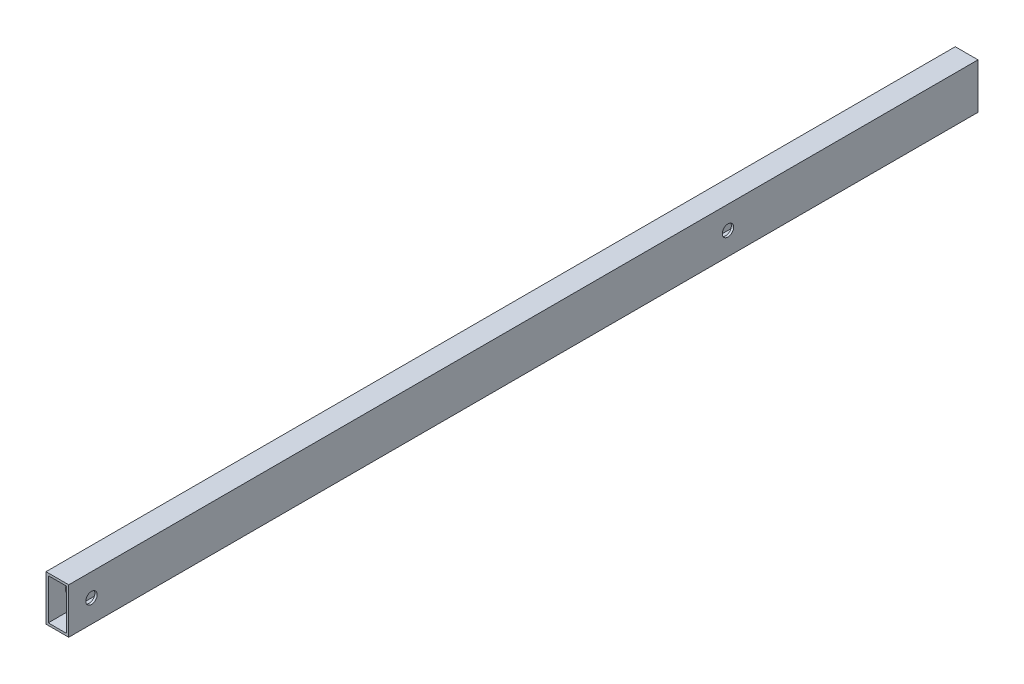
ISO-10303-21;
HEADER;
FILE_DESCRIPTION(('STEP AP214'),'2;1');
FILE_NAME('part.step','',(''),(''),'','','');
FILE_SCHEMA(('AUTOMOTIVE_DESIGN { 1 0 10303 214 1 1 1 1 }'));
ENDSEC;
DATA;
#1=APPLICATION_CONTEXT('core data for automotive mechanical design processes');
#2=APPLICATION_PROTOCOL_DEFINITION('international standard','automotive_design',2000,#1);
#3=PRODUCT_CONTEXT('',#1,'mechanical');
#4=PRODUCT('Part','Part','',(#3));
#5=PRODUCT_RELATED_PRODUCT_CATEGORY('part','',(#4));
#6=PRODUCT_DEFINITION_FORMATION('','',#4);
#7=PRODUCT_DEFINITION_CONTEXT('part definition',#1,'design');
#8=PRODUCT_DEFINITION('design','',#6,#7);
#9=PRODUCT_DEFINITION_SHAPE('','',#8);
#10=(LENGTH_UNIT() NAMED_UNIT(*) SI_UNIT(.MILLI.,.METRE.));
#11=(NAMED_UNIT(*) PLANE_ANGLE_UNIT() SI_UNIT($,.RADIAN.));
#12=(NAMED_UNIT(*) SI_UNIT($,.STERADIAN.) SOLID_ANGLE_UNIT());
#13=UNCERTAINTY_MEASURE_WITH_UNIT(LENGTH_MEASURE(1.E-05),#10,'distance_accuracy_value','');
#14=(GEOMETRIC_REPRESENTATION_CONTEXT(3) GLOBAL_UNCERTAINTY_ASSIGNED_CONTEXT((#13)) GLOBAL_UNIT_ASSIGNED_CONTEXT((#10,
#11,#12)) REPRESENTATION_CONTEXT('',''));
#15=CARTESIAN_POINT('',(0.,0.,0.));
#16=DIRECTION('',(0.,0.,1.));
#17=DIRECTION('',(1.,0.,0.));
#18=AXIS2_PLACEMENT_3D('',#15,#16,#17);
#19=CARTESIAN_POINT('',(0.,0.,400.));
#20=DIRECTION('',(0.,0.,-1.));
#21=DIRECTION('',(-1.,0.,0.));
#22=AXIS2_PLACEMENT_3D('',#19,#20,#21);
#23=PLANE('',#22);
#24=DIRECTION('',(0.,1.,0.));
#25=VECTOR('',#24,1.);
#26=CARTESIAN_POINT('',(5.00000000000001,-9.99999999999999,400.));
#27=LINE('',#26,#25);
#28=CARTESIAN_POINT('',(5.00000000000001,-9.99999999999999,400.));
#29=VERTEX_POINT('',#28);
#30=CARTESIAN_POINT('',(5.00000000000001,10.,400.));
#31=VERTEX_POINT('',#30);
#32=EDGE_CURVE('E142',#29,#31,#27,.T.);
#33=ORIENTED_EDGE('',*,*,#32,.T.);
#34=DIRECTION('',(-1.,0.,0.));
#35=VECTOR('',#34,1.);
#36=CARTESIAN_POINT('',(-4.99999999999999,10.,400.));
#37=LINE('',#36,#35);
#38=CARTESIAN_POINT('',(-4.99999999999999,10.,400.));
#39=VERTEX_POINT('',#38);
#40=EDGE_CURVE('E145',#31,#39,#37,.T.);
#41=ORIENTED_EDGE('',*,*,#40,.T.);
#42=DIRECTION('',(0.,-1.,0.));
#43=VECTOR('',#42,1.);
#44=CARTESIAN_POINT('',(-4.99999999999999,-9.99999999999999,400.));
#45=LINE('',#44,#43);
#46=CARTESIAN_POINT('',(-4.99999999999999,-9.99999999999999,400.));
#47=VERTEX_POINT('',#46);
#48=EDGE_CURVE('E148',#39,#47,#45,.T.);
#49=ORIENTED_EDGE('',*,*,#48,.T.);
#50=DIRECTION('',(1.,0.,0.));
#51=VECTOR('',#50,1.);
#52=CARTESIAN_POINT('',(-4.99999999999999,-9.99999999999999,400.));
#53=LINE('',#52,#51);
#54=EDGE_CURVE('E150',#47,#29,#53,.T.);
#55=ORIENTED_EDGE('',*,*,#54,.T.);
#56=EDGE_LOOP('',(#33,#41,#49,#55));
#57=FACE_BOUND('',#56,.T.);
#58=DIRECTION('',(0.,-1.,0.));
#59=VECTOR('',#58,1.);
#60=CARTESIAN_POINT('',(-3.99999999999999,-8.99999999999999,400.));
#61=LINE('',#60,#59);
#62=CARTESIAN_POINT('',(-3.99999999999999,9.00000000000001,400.));
#63=VERTEX_POINT('',#62);
#64=CARTESIAN_POINT('',(-3.99999999999999,-8.99999999999999,400.));
#65=VERTEX_POINT('',#64);
#66=EDGE_CURVE('E104',#63,#65,#61,.T.);
#67=ORIENTED_EDGE('',*,*,#66,.F.);
#68=DIRECTION('',(-1.,0.,0.));
#69=VECTOR('',#68,1.);
#70=CARTESIAN_POINT('',(-3.99999999999999,9.00000000000001,400.));
#71=LINE('',#70,#69);
#72=CARTESIAN_POINT('',(4.00000000000001,9.00000000000001,400.));
#73=VERTEX_POINT('',#72);
#74=EDGE_CURVE('E126',#73,#63,#71,.T.);
#75=ORIENTED_EDGE('',*,*,#74,.F.);
#76=DIRECTION('',(0.,1.,0.));
#77=VECTOR('',#76,1.);
#78=CARTESIAN_POINT('',(4.00000000000001,-8.99999999999999,400.));
#79=LINE('',#78,#77);
#80=CARTESIAN_POINT('',(4.00000000000001,-8.99999999999999,400.));
#81=VERTEX_POINT('',#80);
#82=EDGE_CURVE('E124',#81,#73,#79,.T.);
#83=ORIENTED_EDGE('',*,*,#82,.F.);
#84=DIRECTION('',(1.,0.,0.));
#85=VECTOR('',#84,1.);
#86=CARTESIAN_POINT('',(-3.99999999999999,-8.99999999999999,400.));
#87=LINE('',#86,#85);
#88=EDGE_CURVE('E112',#65,#81,#87,.T.);
#89=ORIENTED_EDGE('',*,*,#88,.F.);
#90=EDGE_LOOP('',(#67,#75,#83,#89));
#91=FACE_BOUND('',#90,.T.);
#92=ADVANCED_FACE('F37',(#57,#91),#23,.F.);
#93=CARTESIAN_POINT('',(0.,0.,0.));
#94=DIRECTION('',(0.,0.,-1.));
#95=DIRECTION('',(-1.,0.,0.));
#96=AXIS2_PLACEMENT_3D('',#93,#94,#95);
#97=PLANE('',#96);
#98=DIRECTION('',(0.,1.,0.));
#99=VECTOR('',#98,1.);
#100=CARTESIAN_POINT('',(5.00000000000001,-9.99999999999999,0.));
#101=LINE('',#100,#99);
#102=CARTESIAN_POINT('',(5.00000000000001,-9.99999999999999,0.));
#103=VERTEX_POINT('',#102);
#104=CARTESIAN_POINT('',(5.00000000000001,10.,0.));
#105=VERTEX_POINT('',#104);
#106=EDGE_CURVE('E120',#103,#105,#101,.T.);
#107=ORIENTED_EDGE('',*,*,#106,.F.);
#108=DIRECTION('',(1.,0.,0.));
#109=VECTOR('',#108,1.);
#110=CARTESIAN_POINT('',(-4.99999999999999,-9.99999999999999,0.));
#111=LINE('',#110,#109);
#112=CARTESIAN_POINT('',(-4.99999999999999,-9.99999999999999,0.));
#113=VERTEX_POINT('',#112);
#114=EDGE_CURVE('E146',#113,#103,#111,.T.);
#115=ORIENTED_EDGE('',*,*,#114,.F.);
#116=DIRECTION('',(0.,-1.,0.));
#117=VECTOR('',#116,1.);
#118=CARTESIAN_POINT('',(-4.99999999999999,-9.99999999999999,0.));
#119=LINE('',#118,#117);
#120=CARTESIAN_POINT('',(-4.99999999999999,10.,0.));
#121=VERTEX_POINT('',#120);
#122=EDGE_CURVE('E157',#121,#113,#119,.T.);
#123=ORIENTED_EDGE('',*,*,#122,.F.);
#124=DIRECTION('',(-1.,0.,0.));
#125=VECTOR('',#124,1.);
#126=CARTESIAN_POINT('',(-4.99999999999999,10.,0.));
#127=LINE('',#126,#125);
#128=EDGE_CURVE('E155',#105,#121,#127,.T.);
#129=ORIENTED_EDGE('',*,*,#128,.F.);
#130=EDGE_LOOP('',(#107,#115,#123,#129));
#131=FACE_BOUND('',#130,.T.);
#132=DIRECTION('',(-1.,0.,0.));
#133=VECTOR('',#132,1.);
#134=CARTESIAN_POINT('',(-3.99999999999999,9.00000000000001,0.));
#135=LINE('',#134,#133);
#136=CARTESIAN_POINT('',(4.00000000000001,9.00000000000001,0.));
#137=VERTEX_POINT('',#136);
#138=CARTESIAN_POINT('',(-3.99999999999999,9.00000000000001,0.));
#139=VERTEX_POINT('',#138);
#140=EDGE_CURVE('E113',#137,#139,#135,.T.);
#141=ORIENTED_EDGE('',*,*,#140,.T.);
#142=DIRECTION('',(0.,-1.,0.));
#143=VECTOR('',#142,1.);
#144=CARTESIAN_POINT('',(-3.99999999999999,-8.99999999999999,0.));
#145=LINE('',#144,#143);
#146=CARTESIAN_POINT('',(-3.99999999999999,-8.99999999999999,0.));
#147=VERTEX_POINT('',#146);
#148=EDGE_CURVE('E62',#139,#147,#145,.T.);
#149=ORIENTED_EDGE('',*,*,#148,.T.);
#150=DIRECTION('',(1.,0.,0.));
#151=VECTOR('',#150,1.);
#152=CARTESIAN_POINT('',(-3.99999999999999,-8.99999999999999,0.));
#153=LINE('',#152,#151);
#154=CARTESIAN_POINT('',(4.00000000000001,-8.99999999999999,0.));
#155=VERTEX_POINT('',#154);
#156=EDGE_CURVE('E119',#147,#155,#153,.T.);
#157=ORIENTED_EDGE('',*,*,#156,.T.);
#158=DIRECTION('',(0.,1.,0.));
#159=VECTOR('',#158,1.);
#160=CARTESIAN_POINT('',(4.00000000000001,-8.99999999999999,0.));
#161=LINE('',#160,#159);
#162=EDGE_CURVE('E134',#155,#137,#161,.T.);
#163=ORIENTED_EDGE('',*,*,#162,.T.);
#164=EDGE_LOOP('',(#141,#149,#157,#163));
#165=FACE_BOUND('',#164,.T.);
#166=ADVANCED_FACE('F204',(#131,#165),#97,.T.);
#167=CARTESIAN_POINT('',(5.00000000000001,-9.99999999999999,400.));
#168=DIRECTION('',(-1.,0.,0.));
#169=DIRECTION('',(0.,0.,1.));
#170=AXIS2_PLACEMENT_3D('',#167,#168,#169);
#171=PLANE('',#170);
#172=CARTESIAN_POINT('',(5.00000000000001,0.,110.));
#173=DIRECTION('',(1.,0.,0.));
#174=DIRECTION('',(0.,0.,-1.));
#175=AXIS2_PLACEMENT_3D('',#172,#173,#174);
#176=CIRCLE('',#175,2.5);
#177=CARTESIAN_POINT('',(5.00000000000001,0.,107.5));
#178=VERTEX_POINT('',#177);
#179=EDGE_CURVE('E175',#178,#178,#176,.T.);
#180=ORIENTED_EDGE('',*,*,#179,.F.);
#181=EDGE_LOOP('',(#180));
#182=FACE_BOUND('',#181,.T.);
#183=CARTESIAN_POINT('',(5.00000000000001,0.,390.));
#184=DIRECTION('',(1.,0.,0.));
#185=DIRECTION('',(0.,0.,-1.));
#186=AXIS2_PLACEMENT_3D('',#183,#184,#185);
#187=CIRCLE('',#186,2.50000000000002);
#188=CARTESIAN_POINT('',(5.00000000000001,0.,387.5));
#189=VERTEX_POINT('',#188);
#190=EDGE_CURVE('E180',#189,#189,#187,.T.);
#191=ORIENTED_EDGE('',*,*,#190,.F.);
#192=EDGE_LOOP('',(#191));
#193=FACE_BOUND('',#192,.T.);
#194=ORIENTED_EDGE('',*,*,#106,.T.);
#195=DIRECTION('',(0.,0.,-1.));
#196=VECTOR('',#195,1.);
#197=CARTESIAN_POINT('',(5.00000000000001,10.,400.));
#198=LINE('',#197,#196);
#199=EDGE_CURVE('E11',#31,#105,#198,.T.);
#200=ORIENTED_EDGE('',*,*,#199,.F.);
#201=ORIENTED_EDGE('',*,*,#32,.F.);
#202=DIRECTION('',(0.,0.,-1.));
#203=VECTOR('',#202,1.);
#204=CARTESIAN_POINT('',(5.00000000000001,-9.99999999999999,400.));
#205=LINE('',#204,#203);
#206=EDGE_CURVE('E152',#29,#103,#205,.T.);
#207=ORIENTED_EDGE('',*,*,#206,.T.);
#208=EDGE_LOOP('',(#194,#200,#201,#207));
#209=FACE_BOUND('',#208,.T.);
#210=ADVANCED_FACE('F39',(#182,#193,#209),#171,.F.);
#211=CARTESIAN_POINT('',(-4.99999999999999,10.,400.));
#212=DIRECTION('',(0.,-1.,0.));
#213=DIRECTION('',(0.,0.,-1.));
#214=AXIS2_PLACEMENT_3D('',#211,#212,#213);
#215=PLANE('',#214);
#216=ORIENTED_EDGE('',*,*,#128,.T.);
#217=DIRECTION('',(0.,0.,-1.));
#218=VECTOR('',#217,1.);
#219=CARTESIAN_POINT('',(-4.99999999999999,10.,400.));
#220=LINE('',#219,#218);
#221=EDGE_CURVE('E46',#39,#121,#220,.T.);
#222=ORIENTED_EDGE('',*,*,#221,.F.);
#223=ORIENTED_EDGE('',*,*,#40,.F.);
#224=ORIENTED_EDGE('',*,*,#199,.T.);
#225=EDGE_LOOP('',(#216,#222,#223,#224));
#226=FACE_BOUND('',#225,.T.);
#227=ADVANCED_FACE('F230',(#226),#215,.F.);
#228=CARTESIAN_POINT('',(-4.99999999999999,-9.99999999999999,400.));
#229=DIRECTION('',(1.,0.,0.));
#230=DIRECTION('',(0.,0.,-1.));
#231=AXIS2_PLACEMENT_3D('',#228,#229,#230);
#232=PLANE('',#231);
#233=CARTESIAN_POINT('',(-4.99999999999999,0.,110.));
#234=DIRECTION('',(1.,0.,0.));
#235=DIRECTION('',(0.,0.,-1.));
#236=AXIS2_PLACEMENT_3D('',#233,#234,#235);
#237=CIRCLE('',#236,2.5);
#238=CARTESIAN_POINT('',(-4.99999999999999,0.,107.5));
#239=VERTEX_POINT('',#238);
#240=EDGE_CURVE('E169',#239,#239,#237,.T.);
#241=ORIENTED_EDGE('',*,*,#240,.T.);
#242=EDGE_LOOP('',(#241));
#243=FACE_BOUND('',#242,.T.);
#244=CARTESIAN_POINT('',(-4.99999999999999,0.,390.));
#245=DIRECTION('',(1.,0.,0.));
#246=DIRECTION('',(0.,0.,-1.));
#247=AXIS2_PLACEMENT_3D('',#244,#245,#246);
#248=CIRCLE('',#247,2.50000000000002);
#249=CARTESIAN_POINT('',(-4.99999999999999,0.,387.5));
#250=VERTEX_POINT('',#249);
#251=EDGE_CURVE('E185',#250,#250,#248,.T.);
#252=ORIENTED_EDGE('',*,*,#251,.T.);
#253=EDGE_LOOP('',(#252));
#254=FACE_BOUND('',#253,.T.);
#255=ORIENTED_EDGE('',*,*,#122,.T.);
#256=DIRECTION('',(0.,0.,-1.));
#257=VECTOR('',#256,1.);
#258=CARTESIAN_POINT('',(-4.99999999999999,-9.99999999999999,400.));
#259=LINE('',#258,#257);
#260=EDGE_CURVE('E162',#47,#113,#259,.T.);
#261=ORIENTED_EDGE('',*,*,#260,.F.);
#262=ORIENTED_EDGE('',*,*,#48,.F.);
#263=ORIENTED_EDGE('',*,*,#221,.T.);
#264=EDGE_LOOP('',(#255,#261,#262,#263));
#265=FACE_BOUND('',#264,.T.);
#266=ADVANCED_FACE('F227',(#243,#254,#265),#232,.F.);
#267=CARTESIAN_POINT('',(-4.99999999999999,-9.99999999999999,400.));
#268=DIRECTION('',(0.,1.,0.));
#269=DIRECTION('',(0.,0.,1.));
#270=AXIS2_PLACEMENT_3D('',#267,#268,#269);
#271=PLANE('',#270);
#272=ORIENTED_EDGE('',*,*,#114,.T.);
#273=ORIENTED_EDGE('',*,*,#206,.F.);
#274=ORIENTED_EDGE('',*,*,#54,.F.);
#275=ORIENTED_EDGE('',*,*,#260,.T.);
#276=EDGE_LOOP('',(#272,#273,#274,#275));
#277=FACE_BOUND('',#276,.T.);
#278=ADVANCED_FACE('F224',(#277),#271,.F.);
#279=CARTESIAN_POINT('',(-3.99999999999999,-8.99999999999999,400.));
#280=DIRECTION('',(1.,0.,0.));
#281=DIRECTION('',(0.,0.,-1.));
#282=AXIS2_PLACEMENT_3D('',#279,#280,#281);
#283=PLANE('',#282);
#284=CARTESIAN_POINT('',(-3.99999999999999,0.,110.));
#285=DIRECTION('',(1.,0.,0.));
#286=DIRECTION('',(0.,0.,-1.));
#287=AXIS2_PLACEMENT_3D('',#284,#285,#286);
#288=CIRCLE('',#287,2.5);
#289=CARTESIAN_POINT('',(-3.99999999999999,0.,107.5));
#290=VERTEX_POINT('',#289);
#291=EDGE_CURVE('E132',#290,#290,#288,.T.);
#292=ORIENTED_EDGE('',*,*,#291,.F.);
#293=EDGE_LOOP('',(#292));
#294=FACE_BOUND('',#293,.T.);
#295=CARTESIAN_POINT('',(-3.99999999999999,0.,390.));
#296=DIRECTION('',(1.,0.,0.));
#297=DIRECTION('',(0.,0.,-1.));
#298=AXIS2_PLACEMENT_3D('',#295,#296,#297);
#299=CIRCLE('',#298,2.50000000000002);
#300=CARTESIAN_POINT('',(-3.99999999999999,0.,387.5));
#301=VERTEX_POINT('',#300);
#302=EDGE_CURVE('E168',#301,#301,#299,.T.);
#303=ORIENTED_EDGE('',*,*,#302,.F.);
#304=EDGE_LOOP('',(#303));
#305=FACE_BOUND('',#304,.T.);
#306=ORIENTED_EDGE('',*,*,#148,.F.);
#307=DIRECTION('',(0.,0.,-1.));
#308=VECTOR('',#307,1.);
#309=CARTESIAN_POINT('',(-3.99999999999999,9.00000000000001,400.));
#310=LINE('',#309,#308);
#311=EDGE_CURVE('E108',#63,#139,#310,.T.);
#312=ORIENTED_EDGE('',*,*,#311,.F.);
#313=ORIENTED_EDGE('',*,*,#66,.T.);
#314=DIRECTION('',(0.,0.,-1.));
#315=VECTOR('',#314,1.);
#316=CARTESIAN_POINT('',(-3.99999999999999,-8.99999999999999,400.));
#317=LINE('',#316,#315);
#318=EDGE_CURVE('E107',#65,#147,#317,.T.);
#319=ORIENTED_EDGE('',*,*,#318,.T.);
#320=EDGE_LOOP('',(#306,#312,#313,#319));
#321=FACE_BOUND('',#320,.T.);
#322=ADVANCED_FACE('F106',(#294,#305,#321),#283,.T.);
#323=CARTESIAN_POINT('',(-3.99999999999999,-8.99999999999999,400.));
#324=DIRECTION('',(0.,1.,0.));
#325=DIRECTION('',(0.,0.,1.));
#326=AXIS2_PLACEMENT_3D('',#323,#324,#325);
#327=PLANE('',#326);
#328=ORIENTED_EDGE('',*,*,#156,.F.);
#329=ORIENTED_EDGE('',*,*,#318,.F.);
#330=ORIENTED_EDGE('',*,*,#88,.T.);
#331=DIRECTION('',(0.,0.,-1.));
#332=VECTOR('',#331,1.);
#333=CARTESIAN_POINT('',(4.00000000000001,-8.99999999999999,400.));
#334=LINE('',#333,#332);
#335=EDGE_CURVE('E121',#81,#155,#334,.T.);
#336=ORIENTED_EDGE('',*,*,#335,.T.);
#337=EDGE_LOOP('',(#328,#329,#330,#336));
#338=FACE_BOUND('',#337,.T.);
#339=ADVANCED_FACE('F116',(#338),#327,.T.);
#340=CARTESIAN_POINT('',(4.00000000000001,-8.99999999999999,400.));
#341=DIRECTION('',(-1.,0.,0.));
#342=DIRECTION('',(0.,0.,1.));
#343=AXIS2_PLACEMENT_3D('',#340,#341,#342);
#344=PLANE('',#343);
#345=CARTESIAN_POINT('',(4.00000000000001,0.,110.));
#346=DIRECTION('',(-1.,0.,0.));
#347=DIRECTION('',(0.,0.,1.));
#348=AXIS2_PLACEMENT_3D('',#345,#346,#347);
#349=CIRCLE('',#348,2.5);
#350=CARTESIAN_POINT('',(4.00000000000001,0.,112.5));
#351=VERTEX_POINT('',#350);
#352=EDGE_CURVE('E41',#351,#351,#349,.T.);
#353=ORIENTED_EDGE('',*,*,#352,.F.);
#354=EDGE_LOOP('',(#353));
#355=FACE_BOUND('',#354,.T.);
#356=CARTESIAN_POINT('',(4.00000000000001,0.,390.));
#357=DIRECTION('',(-1.,0.,0.));
#358=DIRECTION('',(0.,0.,1.));
#359=AXIS2_PLACEMENT_3D('',#356,#357,#358);
#360=CIRCLE('',#359,2.50000000000002);
#361=CARTESIAN_POINT('',(4.00000000000001,0.,392.5));
#362=VERTEX_POINT('',#361);
#363=EDGE_CURVE('E166',#362,#362,#360,.T.);
#364=ORIENTED_EDGE('',*,*,#363,.F.);
#365=EDGE_LOOP('',(#364));
#366=FACE_BOUND('',#365,.T.);
#367=ORIENTED_EDGE('',*,*,#162,.F.);
#368=ORIENTED_EDGE('',*,*,#335,.F.);
#369=ORIENTED_EDGE('',*,*,#82,.T.);
#370=DIRECTION('',(0.,0.,-1.));
#371=VECTOR('',#370,1.);
#372=CARTESIAN_POINT('',(4.00000000000001,9.00000000000001,400.));
#373=LINE('',#372,#371);
#374=EDGE_CURVE('E54',#73,#137,#373,.T.);
#375=ORIENTED_EDGE('',*,*,#374,.T.);
#376=EDGE_LOOP('',(#367,#368,#369,#375));
#377=FACE_BOUND('',#376,.T.);
#378=ADVANCED_FACE('F196',(#355,#366,#377),#344,.T.);
#379=CARTESIAN_POINT('',(-3.99999999999999,9.00000000000001,400.));
#380=DIRECTION('',(0.,-1.,0.));
#381=DIRECTION('',(0.,0.,-1.));
#382=AXIS2_PLACEMENT_3D('',#379,#380,#381);
#383=PLANE('',#382);
#384=ORIENTED_EDGE('',*,*,#140,.F.);
#385=ORIENTED_EDGE('',*,*,#374,.F.);
#386=ORIENTED_EDGE('',*,*,#74,.T.);
#387=ORIENTED_EDGE('',*,*,#311,.T.);
#388=EDGE_LOOP('',(#384,#385,#386,#387));
#389=FACE_BOUND('',#388,.T.);
#390=ADVANCED_FACE('F199',(#389),#383,.T.);
#391=CARTESIAN_POINT('',(-4.99999999999999,0.,390.));
#392=DIRECTION('',(1.,0.,0.));
#393=DIRECTION('',(0.,0.,-1.));
#394=AXIS2_PLACEMENT_3D('',#391,#392,#393);
#395=CYLINDRICAL_SURFACE('',#394,2.50000000000002);
#396=ORIENTED_EDGE('',*,*,#363,.T.);
#397=EDGE_LOOP('',(#396));
#398=FACE_BOUND('',#397,.T.);
#399=ORIENTED_EDGE('',*,*,#190,.T.);
#400=EDGE_LOOP('',(#399));
#401=FACE_BOUND('',#400,.T.);
#402=ADVANCED_FACE('F206',(#398,#401),#395,.F.);
#403=CARTESIAN_POINT('',(-4.99999999999999,0.,110.));
#404=DIRECTION('',(1.,0.,0.));
#405=DIRECTION('',(0.,0.,-1.));
#406=AXIS2_PLACEMENT_3D('',#403,#404,#405);
#407=CYLINDRICAL_SURFACE('',#406,2.5);
#408=ORIENTED_EDGE('',*,*,#352,.T.);
#409=EDGE_LOOP('',(#408));
#410=FACE_BOUND('',#409,.T.);
#411=ORIENTED_EDGE('',*,*,#179,.T.);
#412=EDGE_LOOP('',(#411));
#413=FACE_BOUND('',#412,.T.);
#414=ADVANCED_FACE('F193',(#410,#413),#407,.F.);
#415=ORIENTED_EDGE('',*,*,#302,.T.);
#416=EDGE_LOOP('',(#415));
#417=FACE_BOUND('',#416,.T.);
#418=ORIENTED_EDGE('',*,*,#251,.F.);
#419=EDGE_LOOP('',(#418));
#420=FACE_BOUND('',#419,.T.);
#421=ADVANCED_FACE('F212',(#417,#420),#395,.F.);
#422=ORIENTED_EDGE('',*,*,#291,.T.);
#423=EDGE_LOOP('',(#422));
#424=FACE_BOUND('',#423,.T.);
#425=ORIENTED_EDGE('',*,*,#240,.F.);
#426=EDGE_LOOP('',(#425));
#427=FACE_BOUND('',#426,.T.);
#428=ADVANCED_FACE('F257',(#424,#427),#407,.F.);
#429=CLOSED_SHELL('',(#92,#166,#210,#227,#266,#278,#322,#339,#378,#390,#402,#414,#421,#428));
#430=MANIFOLD_SOLID_BREP('B2',#429);
#431=ADVANCED_BREP_SHAPE_REPRESENTATION('',(#18,#430),#14);
#432=SHAPE_DEFINITION_REPRESENTATION(#9,#431);
ENDSEC;
END-ISO-10303-21;
